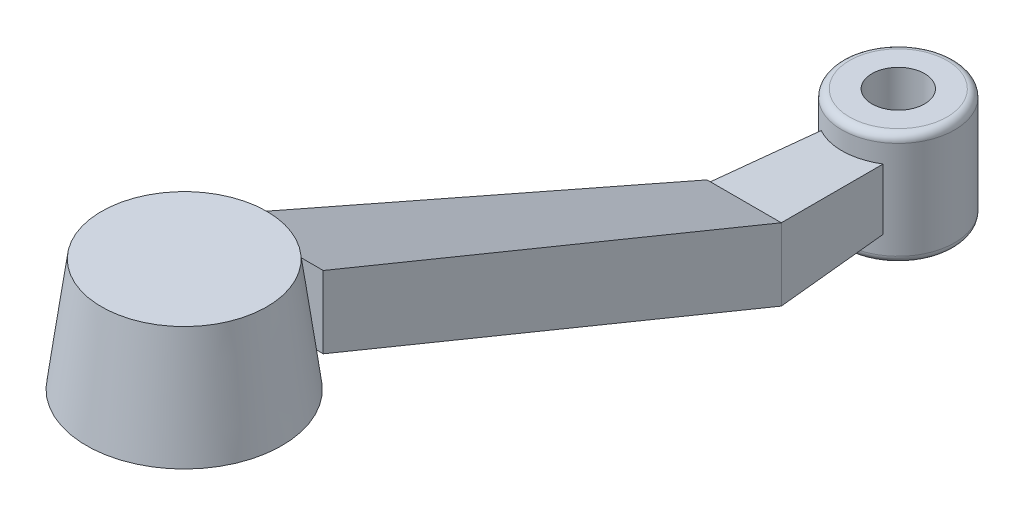
ISO-10303-21;
HEADER;
FILE_DESCRIPTION(('STEP AP214'),'2;1');
FILE_NAME('part.step','',(''),(''),'','','');
FILE_SCHEMA(('AUTOMOTIVE_DESIGN { 1 0 10303 214 1 1 1 1 }'));
ENDSEC;
DATA;
#1=APPLICATION_CONTEXT('core data for automotive mechanical design processes');
#2=APPLICATION_PROTOCOL_DEFINITION('international standard','automotive_design',2000,#1);
#3=PRODUCT_CONTEXT('',#1,'mechanical');
#4=PRODUCT('Part','Part','',(#3));
#5=PRODUCT_RELATED_PRODUCT_CATEGORY('part','',(#4));
#6=PRODUCT_DEFINITION_FORMATION('','',#4);
#7=PRODUCT_DEFINITION_CONTEXT('part definition',#1,'design');
#8=PRODUCT_DEFINITION('design','',#6,#7);
#9=PRODUCT_DEFINITION_SHAPE('','',#8);
#10=(LENGTH_UNIT() NAMED_UNIT(*) SI_UNIT(.MILLI.,.METRE.));
#11=(NAMED_UNIT(*) PLANE_ANGLE_UNIT() SI_UNIT($,.RADIAN.));
#12=(NAMED_UNIT(*) SI_UNIT($,.STERADIAN.) SOLID_ANGLE_UNIT());
#13=UNCERTAINTY_MEASURE_WITH_UNIT(LENGTH_MEASURE(1.E-05),#10,'distance_accuracy_value','');
#14=(GEOMETRIC_REPRESENTATION_CONTEXT(3) GLOBAL_UNCERTAINTY_ASSIGNED_CONTEXT((#13)) GLOBAL_UNIT_ASSIGNED_CONTEXT((#10,
#11,#12)) REPRESENTATION_CONTEXT('',''));
#15=CARTESIAN_POINT('',(0.,0.,0.));
#16=DIRECTION('',(0.,0.,1.));
#17=DIRECTION('',(1.,0.,0.));
#18=AXIS2_PLACEMENT_3D('',#15,#16,#17);
#19=CARTESIAN_POINT('',(21.4,77.6270318976654,166.));
#20=DIRECTION('',(0.,0.,-1.));
#21=DIRECTION('',(0.,1.,0.));
#22=AXIS2_PLACEMENT_3D('',#19,#20,#21);
#23=PLANE('',#22);
#24=CARTESIAN_POINT('',(17.9239272239333,26.0959924674699,166.));
#25=CARTESIAN_POINT('',(17.6827311464605,27.1782961263599,166.));
#26=CARTESIAN_POINT('',(17.4386125656765,28.2599546563529,166.));
#27=CARTESIAN_POINT('',(16.9436438453735,30.4217564482646,166.));
#28=CARTESIAN_POINT('',(16.6927935463918,31.5018996736494,166.));
#29=CARTESIAN_POINT('',(16.1832810282812,33.6612640018218,166.));
#30=CARTESIAN_POINT('',(15.9246126782648,34.7404836605984,166.));
#31=CARTESIAN_POINT('',(15.3985258454148,36.8967823552322,166.));
#32=CARTESIAN_POINT('',(15.1311074335923,37.9738614083864,166.));
#33=CARTESIAN_POINT('',(14.5891266636743,40.1135740539071,166.));
#34=CARTESIAN_POINT('',(14.3146757954944,41.1762358284584,166.));
#35=CARTESIAN_POINT('',(13.754120784732,43.2984791003194,166.));
#36=CARTESIAN_POINT('',(13.4680167405296,44.3580606235529,166.));
#37=CARTESIAN_POINT('',(12.8820368859867,46.4729516240501,166.));
#38=CARTESIAN_POINT('',(12.5821668094427,47.5282626842718,166.));
#39=CARTESIAN_POINT('',(11.9655630904913,49.633922322839,166.));
#40=CARTESIAN_POINT('',(11.6488300199212,50.6842710681471,166.));
#41=CARTESIAN_POINT('',(10.9938642014717,52.7801412471793,166.));
#42=CARTESIAN_POINT('',(10.6555979727385,53.8256523113651,166.));
#43=CARTESIAN_POINT('',(10.127754367075,55.3873443001456,166.));
#44=CARTESIAN_POINT('',(9.94834329619116,55.9069645185297,166.));
#45=CARTESIAN_POINT('',(9.58166182814717,56.9434266699454,166.));
#46=CARTESIAN_POINT('',(9.39439151577363,57.4602686328815,166.));
#47=CARTESIAN_POINT('',(9.00830952148322,58.4969657485795,166.));
#48=CARTESIAN_POINT('',(8.80938320270066,59.0167783407434,166.));
#49=CARTESIAN_POINT('',(8.40040861344593,60.0520032756421,166.));
#50=CARTESIAN_POINT('',(8.19036075925639,60.567415782236,166.));
#51=CARTESIAN_POINT('',(7.75708767481715,61.5919749901617,166.));
#52=CARTESIAN_POINT('',(7.53387860050517,62.10112848319,166.));
#53=CARTESIAN_POINT('',(7.07094238919664,63.1118062442749,166.));
#54=CARTESIAN_POINT('',(6.8312178603344,63.6133317017556,166.));
#55=CARTESIAN_POINT('',(6.32678045602189,64.6138982689497,166.));
#56=CARTESIAN_POINT('',(6.06172953168269,65.1127716611134,166.));
#57=CARTESIAN_POINT('',(5.64228538571866,65.8495403827626,166.));
#58=CARTESIAN_POINT('',(5.49861025926934,66.0935387075457,166.));
#59=CARTESIAN_POINT('',(5.20279578085425,66.5763323878486,166.));
#60=CARTESIAN_POINT('',(5.05065764895381,66.8151284864729,166.));
#61=CARTESIAN_POINT('',(4.73904244748549,67.2820512080469,166.));
#62=CARTESIAN_POINT('',(4.57973486583907,67.5102903535469,166.));
#63=CARTESIAN_POINT('',(4.24945867242793,67.9584205228396,166.));
#64=CARTESIAN_POINT('',(4.07848440883478,68.1783074190031,166.));
#65=CARTESIAN_POINT('',(3.72338057729925,68.605551593862,166.));
#66=CARTESIAN_POINT('',(3.53931585459794,68.8129623638396,166.));
#67=CARTESIAN_POINT('',(3.15452789329485,69.2115616440101,166.));
#68=CARTESIAN_POINT('',(2.95382771917322,69.4027718953076,166.));
#69=CARTESIAN_POINT('',(2.65437473154057,69.6577825478028,166.));
#70=CARTESIAN_POINT('',(2.56385159251628,69.7312702760829,166.));
#71=CARTESIAN_POINT('',(2.37898500518089,69.8732990144325,166.));
#72=CARTESIAN_POINT('',(2.2846408267429,69.9418390720696,166.));
#73=CARTESIAN_POINT('',(1.99532479332395,70.1388708692423,166.));
#74=CARTESIAN_POINT('',(1.79420540391192,70.2586551819868,166.));
#75=CARTESIAN_POINT('',(1.37234408699266,70.4670908537945,166.));
#76=CARTESIAN_POINT('',(1.15136091469549,70.5552680982792,166.));
#77=CARTESIAN_POINT('',(0.696449420749127,70.6863379461502,166.));
#78=CARTESIAN_POINT('',(0.462562299574849,70.729366789059,166.));
#79=CARTESIAN_POINT('',(0.0202504045603927,70.7607440832479,166.));
#80=CARTESIAN_POINT('',(-0.187740502465551,70.7552044526576,166.));
#81=CARTESIAN_POINT('',(-0.598963783353004,70.7047042680344,166.));
#82=CARTESIAN_POINT('',(-0.802189774954127,70.6596936326135,166.));
#83=CARTESIAN_POINT('',(-1.23349535111966,70.5250599150108,166.));
#84=CARTESIAN_POINT('',(-1.45947111647099,70.4288690900823,166.));
#85=CARTESIAN_POINT('',(-1.89334240699332,70.2022257741163,166.));
#86=CARTESIAN_POINT('',(-2.10120491016726,70.071712380845,166.));
#87=CARTESIAN_POINT('',(-2.47846919192251,69.8017433565819,166.));
#88=CARTESIAN_POINT('',(-2.64961697818679,69.6646703403026,166.));
#89=CARTESIAN_POINT('',(-2.9796547628262,69.3763616942935,166.));
#90=CARTESIAN_POINT('',(-3.13853382885316,69.22511369325,166.));
#91=CARTESIAN_POINT('',(-3.44603109731773,68.9117043673542,166.));
#92=CARTESIAN_POINT('',(-3.59461592305407,68.7495106281526,166.));
#93=CARTESIAN_POINT('',(-3.88245480934567,68.4172235122747,166.));
#94=CARTESIAN_POINT('',(-4.02171259665467,68.2471333372877,166.));
#95=CARTESIAN_POINT('',(-4.38557644856646,67.7814281987954,166.));
#96=CARTESIAN_POINT('',(-4.60285388713939,67.4800975705017,166.));
#97=CARTESIAN_POINT('',(-5.01979401254397,66.865404810409,166.));
#98=CARTESIAN_POINT('',(-5.21944554432556,66.5520352369134,166.));
#99=CARTESIAN_POINT('',(-5.60490808165518,65.9160846505242,166.));
#100=CARTESIAN_POINT('',(-5.79069047529827,65.5934863963743,166.));
#101=CARTESIAN_POINT('',(-6.15058696616298,64.9418358849462,166.));
#102=CARTESIAN_POINT('',(-6.32469961452163,64.6127828328011,166.));
#103=CARTESIAN_POINT('',(-6.66494015229138,63.9462767765084,166.));
#104=CARTESIAN_POINT('',(-6.83096621498204,63.6087720095161,166.));
#105=CARTESIAN_POINT('',(-7.15461473473991,62.929750917983,166.));
#106=CARTESIAN_POINT('',(-7.31223676015561,62.5882343884857,166.));
#107=CARTESIAN_POINT('',(-7.62005028950469,61.9024605762825,166.));
#108=CARTESIAN_POINT('',(-7.77025203237181,61.5582078769616,166.));
#109=CARTESIAN_POINT('',(-8.06440039969598,60.8670608254677,166.));
#110=CARTESIAN_POINT('',(-8.20834720815307,60.5201665513545,166.));
#111=CARTESIAN_POINT('',(-8.63934983937411,59.4580740971266,166.));
#112=CARTESIAN_POINT('',(-8.9176541102576,58.7393198161367,166.));
#113=CARTESIAN_POINT('',(-9.45628609957449,57.2950804665782,166.));
#114=CARTESIAN_POINT('',(-9.71661184800188,56.5695946702489,166.));
#115=CARTESIAN_POINT('',(-10.2227651127571,55.1133108420616,166.));
#116=CARTESIAN_POINT('',(-10.4685874630203,54.3825110202383,166.));
#117=CARTESIAN_POINT('',(-10.9481538871831,52.9169557009315,166.));
#118=CARTESIAN_POINT('',(-11.1818976815447,52.1822001123325,166.));
#119=CARTESIAN_POINT('',(-11.639740701217,50.7077826663081,166.));
#120=CARTESIAN_POINT('',(-11.8638156819834,49.9681132983134,166.));
#121=CARTESIAN_POINT('',(-12.3031964816351,48.486175117299,166.));
#122=CARTESIAN_POINT('',(-12.5185022238116,47.743906281602,166.));
#123=CARTESIAN_POINT('',(-13.1529858408901,45.514204202047,166.));
#124=CARTESIAN_POINT('',(-13.5608319824521,44.0235431865221,166.));
#125=CARTESIAN_POINT('',(-14.3190065775523,41.164825193733,166.));
#126=CARTESIAN_POINT('',(-14.6712626727008,39.7972750367155,166.));
#127=CARTESIAN_POINT('',(-15.3598567082508,37.0580858978926,166.));
#128=CARTESIAN_POINT('',(-15.6961936180206,35.6864466574482,166.));
#129=CARTESIAN_POINT('',(-16.3540840499336,32.9463762732672,166.));
#130=CARTESIAN_POINT('',(-16.6756990081798,31.5779598421443,166.));
#131=CARTESIAN_POINT('',(-17.1497610757308,29.5234877840516,166.));
#132=CARTESIAN_POINT('',(-17.3063805354995,28.8383911198239,166.));
#133=CARTESIAN_POINT('',(-17.6170389135076,27.4676155446803,166.));
#134=CARTESIAN_POINT('',(-17.7710778414648,26.7819366359672,166.));
#135=CARTESIAN_POINT('',(-17.9239272239333,26.09599246747,166.));
#136=B_SPLINE_CURVE_WITH_KNOTS('',3,(#24,#25,#26,#27,#28,#29,#30,#31,#32,#33,#34,#35,#36,#37,
#38,#39,#40,#41,#42,#43,#44,#45,#46,#47,#48,#49,#50,#51,#52,#53,#54,#55,#56,#57,#58,#59,#60,#61,
#62,#63,#64,#65,#66,#67,#68,#69,#70,#71,#72,#73,#74,#75,#76,#77,#78,#79,#80,#81,#82,#83,#84,#85,
#86,#87,#88,#89,#90,#91,#92,#93,#94,#95,#96,#97,#98,#99,#100,#101,#102,#103,#104,#105,#106,#107,
#108,#109,#110,#111,#112,#113,#114,#115,#116,#117,#118,#119,#120,#121,#122,#123,#124,#125,#126,
#127,#128,#129,#130,#131,#132,#133,#134,#135),.UNSPECIFIED.,.F.,.F.,(4,2,2,2,2,2,2,2,2,2,2,2,2,
2,2,2,2,2,2,2,2,2,2,2,2,2,2,2,2,2,2,2,2,2,2,2,2,2,2,2,2,2,2,2,2,2,2,2,2,2,2,2,2,2,2,4),(0.,
3.32656630553289,6.6532114812507,9.98253678385132,13.3118350739607,16.6043709291515,
19.8968789933855,23.1880278965628,26.4790652652951,29.7753509785415,31.4244650096707,
33.0735612544932,34.7431825581498,36.4127414114668,38.0802918378079,39.7475795241848,
41.441505778102,42.2908420945388,43.1400562825324,43.9747824145778,44.8099158337655,
45.6411672313995,46.4712848111963,46.820928082827,47.1706384826925,47.8705983370675,
48.5806570738027,49.2885669251377,49.908805945913,50.5298330755358,51.2625543209664,
51.9965845894948,52.6534454110083,53.3108849477631,53.9703649553072,54.6295798663486,
55.7431484348223,56.8574167785086,57.9739237236716,59.0905690335036,60.2188229519682,
61.3471347645452,62.473843498186,63.6005190652134,65.9124271871475,68.2245882369997,
70.53756795995,72.8506011889937,75.1691322229887,77.4876835339681,82.123743964299,
86.3602097581668,90.5969494529703,94.8140007404766,96.9223096882448,99.0306106946727),.UNSPECIFIED.);
#137=CARTESIAN_POINT('',(9.03535052357532,58.4207911856162,166.));
#138=VERTEX_POINT('',#137);
#139=CARTESIAN_POINT('',(-9.03535052357531,58.4207911856162,166.));
#140=VERTEX_POINT('',#139);
#141=EDGE_CURVE('E55',#138,#140,#136,.T.);
#142=ORIENTED_EDGE('',*,*,#141,.F.);
#143=DIRECTION('',(-1.,0.,0.));
#144=VECTOR('',#143,1.);
#145=CARTESIAN_POINT('',(21.4,58.4207911856162,166.));
#146=LINE('',#145,#144);
#147=CARTESIAN_POINT('',(13.,58.4207911856162,166.));
#148=VERTEX_POINT('',#147);
#149=EDGE_CURVE('E109',#148,#138,#146,.T.);
#150=ORIENTED_EDGE('',*,*,#149,.F.);
#151=DIRECTION('',(0.,-1.,0.));
#152=VECTOR('',#151,1.);
#153=CARTESIAN_POINT('',(13.,150.8,166.));
#154=LINE('',#153,#152);
#155=CARTESIAN_POINT('',(13.,77.6270318976654,166.));
#156=VERTEX_POINT('',#155);
#157=EDGE_CURVE('E207',#156,#148,#154,.T.);
#158=ORIENTED_EDGE('',*,*,#157,.F.);
#159=DIRECTION('',(-1.,0.,0.));
#160=VECTOR('',#159,1.);
#161=CARTESIAN_POINT('',(21.4,77.6270318976654,166.));
#162=LINE('',#161,#160);
#163=CARTESIAN_POINT('',(-13.,77.6270318976654,166.));
#164=VERTEX_POINT('',#163);
#165=EDGE_CURVE('E118',#156,#164,#162,.T.);
#166=ORIENTED_EDGE('',*,*,#165,.T.);
#167=DIRECTION('',(0.,-1.,0.));
#168=VECTOR('',#167,1.);
#169=CARTESIAN_POINT('',(-13.,150.8,166.));
#170=LINE('',#169,#168);
#171=CARTESIAN_POINT('',(-13.,58.4207911856162,166.));
#172=VERTEX_POINT('',#171);
#173=EDGE_CURVE('E205',#164,#172,#170,.T.);
#174=ORIENTED_EDGE('',*,*,#173,.T.);
#175=EDGE_CURVE('E111',#140,#172,#146,.T.);
#176=ORIENTED_EDGE('',*,*,#175,.F.);
#177=EDGE_LOOP('',(#142,#150,#158,#166,#174,#176));
#178=FACE_BOUND('',#177,.T.);
#179=ADVANCED_FACE('F41',(#178),#23,.F.);
#180=CARTESIAN_POINT('',(21.4,24.5676798714646,41.));
#181=DIRECTION('',(0.,-0.92050485345244,0.390731128489275));
#182=DIRECTION('',(0.,-0.390731128489275,-0.92050485345244));
#183=AXIS2_PLACEMENT_3D('',#180,#181,#182);
#184=PLANE('',#183);
#185=DIRECTION('',(-1.,0.,0.));
#186=VECTOR('',#185,1.);
#187=CARTESIAN_POINT('',(21.4,24.5676798714646,41.));
#188=LINE('',#187,#186);
#189=CARTESIAN_POINT('',(-8.99271441662236,24.5676798714646,41.));
#190=VERTEX_POINT('',#189);
#191=CARTESIAN_POINT('',(-9.88472756845761,24.5676798714646,41.));
#192=VERTEX_POINT('',#191);
#193=EDGE_CURVE('E121',#190,#192,#188,.T.);
#194=ORIENTED_EDGE('',*,*,#193,.T.);
#195=DIRECTION('',(-0.022934952732926,0.390628350329571,0.920262723281747));
#196=VECTOR('',#195,1.);
#197=CARTESIAN_POINT('',(-9.86827142456097,24.287398659727,40.339698844232));
#198=LINE('',#197,#196);
#199=EDGE_CURVE('E62',#192,#164,#198,.T.);
#200=ORIENTED_EDGE('',*,*,#199,.T.);
#201=ORIENTED_EDGE('',*,*,#165,.F.);
#202=DIRECTION('',(0.022934952732926,0.390628350329571,0.920262723281747));
#203=VECTOR('',#202,1.);
#204=CARTESIAN_POINT('',(9.89078474059465,24.6708456894676,41.2430434364146));
#205=LINE('',#204,#203);
#206=CARTESIAN_POINT('',(9.88472756845761,24.5676798714646,41.));
#207=VERTEX_POINT('',#206);
#208=EDGE_CURVE('E128',#207,#156,#205,.T.);
#209=ORIENTED_EDGE('',*,*,#208,.F.);
#210=DIRECTION('',(1.,0.,0.));
#211=VECTOR('',#210,1.);
#212=CARTESIAN_POINT('',(-7.63011215526329,24.5676798714646,41.));
#213=LINE('',#212,#211);
#214=EDGE_CURVE('E136',#207,#190,#213,.F.);
#215=ORIENTED_EDGE('',*,*,#214,.T.);
#216=EDGE_LOOP('',(#194,#200,#201,#209,#215));
#217=FACE_BOUND('',#216,.T.);
#218=ADVANCED_FACE('F214',(#217),#184,.F.);
#219=CARTESIAN_POINT('',(21.4,5.36143915941544,41.));
#220=DIRECTION('',(0.,-0.92050485345244,0.390731128489275));
#221=DIRECTION('',(0.,-0.390731128489275,-0.92050485345244));
#222=AXIS2_PLACEMENT_3D('',#219,#220,#221);
#223=PLANE('',#222);
#224=ORIENTED_EDGE('',*,*,#149,.T.);
#225=CARTESIAN_POINT('',(0.,68.0228656652482,188.621069879657));
#226=DIRECTION('',(0.,-0.92050485345244,0.390731128489275));
#227=DIRECTION('',(0.,-0.390731128489275,-0.92050485345244));
#228=AXIS2_PLACEMENT_3D('',#225,#226,#227);
#229=ELLIPSE('',#228,26.4682671753336,24.3251156917832);
#230=EDGE_CURVE('E11',#138,#140,#229,.F.);
#231=ORIENTED_EDGE('',*,*,#230,.T.);
#232=ORIENTED_EDGE('',*,*,#175,.T.);
#233=DIRECTION('',(-0.022934952732926,0.390628350329571,0.920262723281747));
#234=VECTOR('',#233,1.);
#235=CARTESIAN_POINT('',(-9.86827142456097,5.08115794767782,40.339698844232));
#236=LINE('',#235,#234);
#237=CARTESIAN_POINT('',(-9.88472756845761,5.36143915941545,41.));
#238=VERTEX_POINT('',#237);
#239=EDGE_CURVE('E204',#238,#172,#236,.T.);
#240=ORIENTED_EDGE('',*,*,#239,.F.);
#241=DIRECTION('',(-1.,0.,0.));
#242=VECTOR('',#241,1.);
#243=CARTESIAN_POINT('',(21.4,5.36143915941544,41.));
#244=LINE('',#243,#242);
#245=CARTESIAN_POINT('',(-8.99271441662236,5.36143915941544,41.));
#246=VERTEX_POINT('',#245);
#247=EDGE_CURVE('E123',#246,#238,#244,.T.);
#248=ORIENTED_EDGE('',*,*,#247,.F.);
#249=DIRECTION('',(-1.,0.,0.));
#250=VECTOR('',#249,1.);
#251=CARTESIAN_POINT('',(-7.63011215526329,5.36143915941544,41.));
#252=LINE('',#251,#250);
#253=CARTESIAN_POINT('',(9.88472756845761,5.36143915941543,41.));
#254=VERTEX_POINT('',#253);
#255=EDGE_CURVE('E132',#246,#254,#252,.F.);
#256=ORIENTED_EDGE('',*,*,#255,.T.);
#257=DIRECTION('',(0.022934952732926,0.390628350329571,0.920262723281747));
#258=VECTOR('',#257,1.);
#259=CARTESIAN_POINT('',(9.89078474059465,5.46460497741846,41.2430434364146));
#260=LINE('',#259,#258);
#261=EDGE_CURVE('E49',#254,#148,#260,.T.);
#262=ORIENTED_EDGE('',*,*,#261,.T.);
#263=EDGE_LOOP('',(#224,#231,#232,#240,#248,#256,#262));
#264=FACE_BOUND('',#263,.T.);
#265=ADVANCED_FACE('F116',(#264),#223,.T.);
#266=CARTESIAN_POINT('',(0.,30.,0.));
#267=DIRECTION('',(0.,1.,0.));
#268=DIRECTION('',(0.,0.,1.));
#269=AXIS2_PLACEMENT_3D('',#266,#267,#268);
#270=PLANE('',#269);
#271=CARTESIAN_POINT('',(0.,30.,0.));
#272=DIRECTION('',(0.,1.,0.));
#273=DIRECTION('',(0.,0.,1.));
#274=AXIS2_PLACEMENT_3D('',#271,#272,#273);
#275=CIRCLE('',#274,13.);
#276=CARTESIAN_POINT('',(0.,30.,13.));
#277=VERTEX_POINT('',#276);
#278=EDGE_CURVE('E164',#277,#277,#275,.T.);
#279=ORIENTED_EDGE('',*,*,#278,.T.);
#280=EDGE_LOOP('',(#279));
#281=FACE_BOUND('',#280,.T.);
#282=CARTESIAN_POINT('',(0.,30.,0.));
#283=DIRECTION('',(0.,1.,0.));
#284=DIRECTION('',(0.,0.,1.));
#285=AXIS2_PLACEMENT_3D('',#282,#283,#284);
#286=CIRCLE('',#285,7.);
#287=CARTESIAN_POINT('',(0.,30.,7.));
#288=VERTEX_POINT('',#287);
#289=EDGE_CURVE('E150',#288,#288,#286,.T.);
#290=ORIENTED_EDGE('',*,*,#289,.F.);
#291=EDGE_LOOP('',(#290));
#292=FACE_BOUND('',#291,.T.);
#293=ADVANCED_FACE('F304',(#281,#292),#270,.T.);
#294=CARTESIAN_POINT('',(0.,0.,0.));
#295=DIRECTION('',(0.,1.,0.));
#296=DIRECTION('',(0.,0.,1.));
#297=AXIS2_PLACEMENT_3D('',#294,#295,#296);
#298=PLANE('',#297);
#299=CARTESIAN_POINT('',(0.,0.,0.));
#300=DIRECTION('',(0.,1.,0.));
#301=DIRECTION('',(0.,0.,1.));
#302=AXIS2_PLACEMENT_3D('',#299,#300,#301);
#303=CIRCLE('',#302,13.);
#304=CARTESIAN_POINT('',(0.,0.,13.));
#305=VERTEX_POINT('',#304);
#306=EDGE_CURVE('E161',#305,#305,#303,.F.);
#307=ORIENTED_EDGE('',*,*,#306,.T.);
#308=EDGE_LOOP('',(#307));
#309=FACE_BOUND('',#308,.T.);
#310=CARTESIAN_POINT('',(0.,0.,0.));
#311=DIRECTION('',(0.,1.,0.));
#312=DIRECTION('',(0.,0.,1.));
#313=AXIS2_PLACEMENT_3D('',#310,#311,#312);
#314=CIRCLE('',#313,7.);
#315=CARTESIAN_POINT('',(0.,0.,7.));
#316=VERTEX_POINT('',#315);
#317=EDGE_CURVE('E142',#316,#316,#314,.T.);
#318=ORIENTED_EDGE('',*,*,#317,.T.);
#319=EDGE_LOOP('',(#318));
#320=FACE_BOUND('',#319,.T.);
#321=ADVANCED_FACE('F377',(#309,#320),#298,.F.);
#322=CARTESIAN_POINT('',(0.,30.,0.));
#323=DIRECTION('',(0.,-1.,0.));
#324=DIRECTION('',(0.,0.,-1.));
#325=AXIS2_PLACEMENT_3D('',#322,#323,#324);
#326=CYLINDRICAL_SURFACE('',#325,15.);
#327=CARTESIAN_POINT('',(0.,7.51015811002013,0.));
#328=DIRECTION('',(0.,-0.998629534754574,-0.052335956242944));
#329=DIRECTION('',(0.,-0.052335956242944,0.998629534754574));
#330=AXIS2_PLACEMENT_3D('',#327,#328,#329);
#331=ELLIPSE('',#330,15.0205851899688,15.);
#332=CARTESIAN_POINT('',(8.38773451157325,6.85843221629979,12.4356708610096));
#333=VERTEX_POINT('',#332);
#334=CARTESIAN_POINT('',(-7.52406284521909,6.83009073081871,12.9764586194074));
#335=VERTEX_POINT('',#334);
#336=EDGE_CURVE('E167',#333,#335,#331,.T.);
#337=ORIENTED_EDGE('',*,*,#336,.T.);
#338=DIRECTION('',(0.,-1.,0.));
#339=VECTOR('',#338,1.);
#340=CARTESIAN_POINT('',(-7.52406284521909,30.,12.9764586194074));
#341=LINE('',#340,#339);
#342=CARTESIAN_POINT('',(-7.52406284521909,23.0990283000613,12.9764586194074));
#343=VERTEX_POINT('',#342);
#344=EDGE_CURVE('E176',#335,#343,#341,.F.);
#345=ORIENTED_EDGE('',*,*,#344,.T.);
#346=CARTESIAN_POINT('',(0.,22.4189609208599,0.));
#347=DIRECTION('',(0.,0.998629534754574,-0.052335956242944));
#348=DIRECTION('',(0.,-0.052335956242944,-0.998629534754574));
#349=AXIS2_PLACEMENT_3D('',#346,#347,#348);
#350=ELLIPSE('',#349,15.0205851899688,15.);
#351=CARTESIAN_POINT('',(8.38773451157325,23.0706868145802,12.4356708610096));
#352=VERTEX_POINT('',#351);
#353=EDGE_CURVE('E173',#343,#352,#350,.T.);
#354=ORIENTED_EDGE('',*,*,#353,.T.);
#355=DIRECTION('',(0.,-1.,0.));
#356=VECTOR('',#355,1.);
#357=CARTESIAN_POINT('',(8.38773451157325,30.,12.4356708610096));
#358=LINE('',#357,#356);
#359=EDGE_CURVE('E170',#352,#333,#358,.T.);
#360=ORIENTED_EDGE('',*,*,#359,.T.);
#361=EDGE_LOOP('',(#337,#345,#354,#360));
#362=FACE_BOUND('',#361,.T.);
#363=CARTESIAN_POINT('',(0.,2.,0.));
#364=DIRECTION('',(0.,1.,0.));
#365=DIRECTION('',(0.,0.,1.));
#366=AXIS2_PLACEMENT_3D('',#363,#364,#365);
#367=CIRCLE('',#366,15.);
#368=CARTESIAN_POINT('',(0.,2.,15.));
#369=VERTEX_POINT('',#368);
#370=EDGE_CURVE('E158',#369,#369,#367,.T.);
#371=ORIENTED_EDGE('',*,*,#370,.T.);
#372=EDGE_LOOP('',(#371));
#373=FACE_BOUND('',#372,.T.);
#374=CARTESIAN_POINT('',(0.,28.,0.));
#375=DIRECTION('',(0.,1.,0.));
#376=DIRECTION('',(0.,0.,1.));
#377=AXIS2_PLACEMENT_3D('',#374,#375,#376);
#378=CIRCLE('',#377,15.);
#379=CARTESIAN_POINT('',(0.,28.,15.));
#380=VERTEX_POINT('',#379);
#381=EDGE_CURVE('E153',#380,#380,#378,.F.);
#382=ORIENTED_EDGE('',*,*,#381,.T.);
#383=EDGE_LOOP('',(#382));
#384=FACE_BOUND('',#383,.T.);
#385=ADVANCED_FACE('F180',(#362,#373,#384),#326,.T.);
#386=CARTESIAN_POINT('',(0.,30.,0.));
#387=DIRECTION('',(0.,-1.,0.));
#388=DIRECTION('',(0.,0.,-1.));
#389=AXIS2_PLACEMENT_3D('',#386,#387,#388);
#390=CYLINDRICAL_SURFACE('',#389,7.);
#391=ORIENTED_EDGE('',*,*,#289,.T.);
#392=EDGE_LOOP('',(#391));
#393=FACE_BOUND('',#392,.T.);
#394=ORIENTED_EDGE('',*,*,#317,.F.);
#395=EDGE_LOOP('',(#394));
#396=FACE_BOUND('',#395,.T.);
#397=ADVANCED_FACE('F358',(#393,#396),#390,.F.);
#398=CARTESIAN_POINT('',(0.,2.,0.));
#399=DIRECTION('',(0.,1.,0.));
#400=DIRECTION('',(0.,0.,1.));
#401=AXIS2_PLACEMENT_3D('',#398,#399,#400);
#402=TOROIDAL_SURFACE('',#401,13.,2.);
#403=ORIENTED_EDGE('',*,*,#306,.F.);
#404=EDGE_LOOP('',(#403));
#405=FACE_BOUND('',#404,.T.);
#406=ORIENTED_EDGE('',*,*,#370,.F.);
#407=EDGE_LOOP('',(#406));
#408=FACE_BOUND('',#407,.T.);
#409=ADVANCED_FACE('F349',(#405,#408),#402,.T.);
#410=CARTESIAN_POINT('',(0.,28.,0.));
#411=DIRECTION('',(0.,1.,0.));
#412=DIRECTION('',(0.,0.,1.));
#413=AXIS2_PLACEMENT_3D('',#410,#411,#412);
#414=TOROIDAL_SURFACE('',#413,13.,2.);
#415=ORIENTED_EDGE('',*,*,#381,.F.);
#416=EDGE_LOOP('',(#415));
#417=FACE_BOUND('',#416,.T.);
#418=ORIENTED_EDGE('',*,*,#278,.F.);
#419=EDGE_LOOP('',(#418));
#420=FACE_BOUND('',#419,.T.);
#421=ADVANCED_FACE('F43',(#417,#420),#414,.T.);
#422=CARTESIAN_POINT('',(-7.63011215526329,23.2050776101055,15.));
#423=DIRECTION('',(-0.998629534754574,0.,-0.052335956242944));
#424=DIRECTION('',(-0.052335956242944,0.,0.998629534754574));
#425=AXIS2_PLACEMENT_3D('',#422,#423,#424);
#426=PLANE('',#425);
#427=ORIENTED_EDGE('',*,*,#344,.F.);
#428=DIRECTION('',(-0.0522644276887141,-0.0522644276887141,0.997264688634237));
#429=VECTOR('',#428,1.);
#430=CARTESIAN_POINT('',(-7.58509304462034,6.76906053141746,14.1409841962619));
#431=LINE('',#430,#429);
#432=EDGE_CURVE('E139',#335,#246,#431,.T.);
#433=ORIENTED_EDGE('',*,*,#432,.T.);
#434=DIRECTION('',(0.,1.,0.));
#435=VECTOR('',#434,1.);
#436=CARTESIAN_POINT('',(-8.99271441662236,23.2050776101055,41.));
#437=LINE('',#436,#435);
#438=EDGE_CURVE('E129',#190,#246,#437,.F.);
#439=ORIENTED_EDGE('',*,*,#438,.F.);
#440=DIRECTION('',(-0.0522644276887141,0.0522644276887141,0.997264688634237));
#441=VECTOR('',#440,1.);
#442=CARTESIAN_POINT('',(-7.63011215526329,23.2050776101055,15.));
#443=LINE('',#442,#441);
#444=EDGE_CURVE('E140',#343,#190,#443,.T.);
#445=ORIENTED_EDGE('',*,*,#444,.F.);
#446=EDGE_LOOP('',(#427,#433,#439,#445));
#447=FACE_BOUND('',#446,.T.);
#448=ADVANCED_FACE('F184',(#447),#426,.T.);
#449=CARTESIAN_POINT('',(8.52212530709853,23.2050776101055,15.));
#450=DIRECTION('',(0.998629534754574,0.,-0.052335956242944));
#451=DIRECTION('',(-0.052335956242944,0.,-0.998629534754574));
#452=AXIS2_PLACEMENT_3D('',#449,#450,#451);
#453=PLANE('',#452);
#454=ORIENTED_EDGE('',*,*,#359,.F.);
#455=DIRECTION('',(0.0522644276887141,0.0522644276887141,0.997264688634237));
#456=VECTOR('',#455,1.);
#457=CARTESIAN_POINT('',(8.52212530709853,23.2050776101055,15.));
#458=LINE('',#457,#456);
#459=EDGE_CURVE('E143',#352,#207,#458,.T.);
#460=ORIENTED_EDGE('',*,*,#459,.T.);
#461=DIRECTION('',(0.,-1.,0.));
#462=VECTOR('',#461,1.);
#463=CARTESIAN_POINT('',(9.88472756845761,23.2050776101055,41.));
#464=LINE('',#463,#462);
#465=EDGE_CURVE('E134',#254,#207,#464,.F.);
#466=ORIENTED_EDGE('',*,*,#465,.F.);
#467=DIRECTION('',(0.0522644276887141,-0.0522644276887141,0.997264688634237));
#468=VECTOR('',#467,1.);
#469=CARTESIAN_POINT('',(8.47800433332626,6.76816239454678,14.1581216686557));
#470=LINE('',#469,#468);
#471=EDGE_CURVE('E145',#333,#254,#470,.T.);
#472=ORIENTED_EDGE('',*,*,#471,.F.);
#473=EDGE_LOOP('',(#454,#460,#466,#472));
#474=FACE_BOUND('',#473,.T.);
#475=ADVANCED_FACE('F194',(#474),#453,.T.);
#476=CARTESIAN_POINT('',(-7.63011215526329,23.2050776101055,15.));
#477=DIRECTION('',(0.,0.998629534754574,-0.052335956242944));
#478=DIRECTION('',(0.,0.052335956242944,0.998629534754574));
#479=AXIS2_PLACEMENT_3D('',#476,#477,#478);
#480=PLANE('',#479);
#481=ORIENTED_EDGE('',*,*,#353,.F.);
#482=ORIENTED_EDGE('',*,*,#444,.T.);
#483=ORIENTED_EDGE('',*,*,#214,.F.);
#484=ORIENTED_EDGE('',*,*,#459,.F.);
#485=EDGE_LOOP('',(#481,#482,#483,#484));
#486=FACE_BOUND('',#485,.T.);
#487=ADVANCED_FACE('F190',(#486),#480,.T.);
#488=CARTESIAN_POINT('',(-7.63011215526329,6.72404142077451,15.));
#489=DIRECTION('',(0.,-0.998629534754574,-0.052335956242944));
#490=DIRECTION('',(0.,0.052335956242944,-0.998629534754574));
#491=AXIS2_PLACEMENT_3D('',#488,#489,#490);
#492=PLANE('',#491);
#493=ORIENTED_EDGE('',*,*,#336,.F.);
#494=ORIENTED_EDGE('',*,*,#471,.T.);
#495=ORIENTED_EDGE('',*,*,#255,.F.);
#496=ORIENTED_EDGE('',*,*,#432,.F.);
#497=EDGE_LOOP('',(#493,#494,#495,#496));
#498=FACE_BOUND('',#497,.T.);
#499=ADVANCED_FACE('F197',(#498),#492,.T.);
#500=CARTESIAN_POINT('',(21.4,24.5676798714646,41.));
#501=DIRECTION('',(0.,0.,-1.));
#502=DIRECTION('',(-1.,0.,0.));
#503=AXIS2_PLACEMENT_3D('',#500,#501,#502);
#504=PLANE('',#503);
#505=DIRECTION('',(0.,-1.,0.));
#506=VECTOR('',#505,1.);
#507=CARTESIAN_POINT('',(-9.88472756845761,150.8,41.));
#508=LINE('',#507,#506);
#509=EDGE_CURVE('E112',#192,#238,#508,.T.);
#510=ORIENTED_EDGE('',*,*,#509,.F.);
#511=ORIENTED_EDGE('',*,*,#193,.F.);
#512=ORIENTED_EDGE('',*,*,#438,.T.);
#513=ORIENTED_EDGE('',*,*,#247,.T.);
#514=EDGE_LOOP('',(#510,#511,#512,#513));
#515=FACE_BOUND('',#514,.T.);
#516=ADVANCED_FACE('F200',(#515),#504,.T.);
#517=CARTESIAN_POINT('',(9.88472756845761,150.8,41.));
#518=DIRECTION('',(0.999689587079788,0.,-0.0249144432858373));
#519=DIRECTION('',(-0.0249144432858373,0.,-0.999689587079788));
#520=AXIS2_PLACEMENT_3D('',#517,#518,#519);
#521=PLANE('',#520);
#522=ORIENTED_EDGE('',*,*,#208,.T.);
#523=ORIENTED_EDGE('',*,*,#157,.T.);
#524=ORIENTED_EDGE('',*,*,#261,.F.);
#525=ORIENTED_EDGE('',*,*,#465,.T.);
#526=EDGE_LOOP('',(#522,#523,#524,#525));
#527=FACE_BOUND('',#526,.T.);
#528=ADVANCED_FACE('F218',(#527),#521,.T.);
#529=CARTESIAN_POINT('',(-9.88472756845761,150.8,41.));
#530=DIRECTION('',(0.999689587079788,0.,0.0249144432858373));
#531=DIRECTION('',(0.0249144432858373,0.,-0.999689587079788));
#532=AXIS2_PLACEMENT_3D('',#529,#530,#531);
#533=PLANE('',#532);
#534=ORIENTED_EDGE('',*,*,#509,.T.);
#535=ORIENTED_EDGE('',*,*,#239,.T.);
#536=ORIENTED_EDGE('',*,*,#173,.F.);
#537=ORIENTED_EDGE('',*,*,#199,.F.);
#538=EDGE_LOOP('',(#534,#535,#536,#537));
#539=FACE_BOUND('',#538,.T.);
#540=ADVANCED_FACE('F219',(#539),#533,.F.);
#541=CARTESIAN_POINT('',(0.,85.754128645527,190.));
#542=DIRECTION('',(0.,-1.,0.));
#543=DIRECTION('',(0.,0.,-1.));
#544=AXIS2_PLACEMENT_3D('',#541,#542,#543);
#545=CONICAL_SURFACE('',#544,22.,0.132551532296674);
#546=CARTESIAN_POINT('',(0.,55.754128645527,190.));
#547=DIRECTION('',(0.,-1.,0.));
#548=DIRECTION('',(0.,0.,-1.));
#549=AXIS2_PLACEMENT_3D('',#546,#547,#548);
#550=CIRCLE('',#549,26.);
#551=CARTESIAN_POINT('',(0.,55.754128645527,164.));
#552=VERTEX_POINT('',#551);
#553=EDGE_CURVE('E260',#552,#552,#550,.T.);
#554=ORIENTED_EDGE('',*,*,#553,.F.);
#555=EDGE_LOOP('',(#554));
#556=FACE_BOUND('',#555,.T.);
#557=CARTESIAN_POINT('',(0.,85.754128645527,190.));
#558=DIRECTION('',(0.,-1.,0.));
#559=DIRECTION('',(0.,0.,-1.));
#560=AXIS2_PLACEMENT_3D('',#557,#558,#559);
#561=CIRCLE('',#560,22.);
#562=CARTESIAN_POINT('',(0.,85.754128645527,168.));
#563=VERTEX_POINT('',#562);
#564=EDGE_CURVE('E113',#563,#563,#561,.T.);
#565=ORIENTED_EDGE('',*,*,#564,.T.);
#566=EDGE_LOOP('',(#565));
#567=FACE_BOUND('',#566,.T.);
#568=ORIENTED_EDGE('',*,*,#230,.F.);
#569=ORIENTED_EDGE('',*,*,#141,.T.);
#570=EDGE_LOOP('',(#568,#569));
#571=FACE_BOUND('',#570,.T.);
#572=ADVANCED_FACE('F102',(#556,#567,#571),#545,.T.);
#573=CARTESIAN_POINT('',(0.,85.754128645527,190.));
#574=DIRECTION('',(0.,-1.,0.));
#575=DIRECTION('',(0.,0.,-1.));
#576=AXIS2_PLACEMENT_3D('',#573,#574,#575);
#577=PLANE('',#576);
#578=ORIENTED_EDGE('',*,*,#564,.F.);
#579=EDGE_LOOP('',(#578));
#580=FACE_BOUND('',#579,.T.);
#581=ADVANCED_FACE('F227',(#580),#577,.F.);
#582=CARTESIAN_POINT('',(0.,55.754128645527,216.));
#583=DIRECTION('',(0.,1.,0.));
#584=DIRECTION('',(0.,0.,1.));
#585=AXIS2_PLACEMENT_3D('',#582,#583,#584);
#586=PLANE('',#585);
#587=ORIENTED_EDGE('',*,*,#553,.T.);
#588=EDGE_LOOP('',(#587));
#589=FACE_BOUND('',#588,.T.);
#590=ADVANCED_FACE('F250',(#589),#586,.F.);
#591=CLOSED_SHELL('',(#179,#218,#265,#293,#321,#385,#397,#409,#421,#448,#475,#487,#499,#516,
#528,#540,#572,#581,#590));
#592=MANIFOLD_SOLID_BREP('B2',#591);
#593=ADVANCED_BREP_SHAPE_REPRESENTATION('',(#18,#592),#14);
#594=SHAPE_DEFINITION_REPRESENTATION(#9,#593);
ENDSEC;
END-ISO-10303-21;
